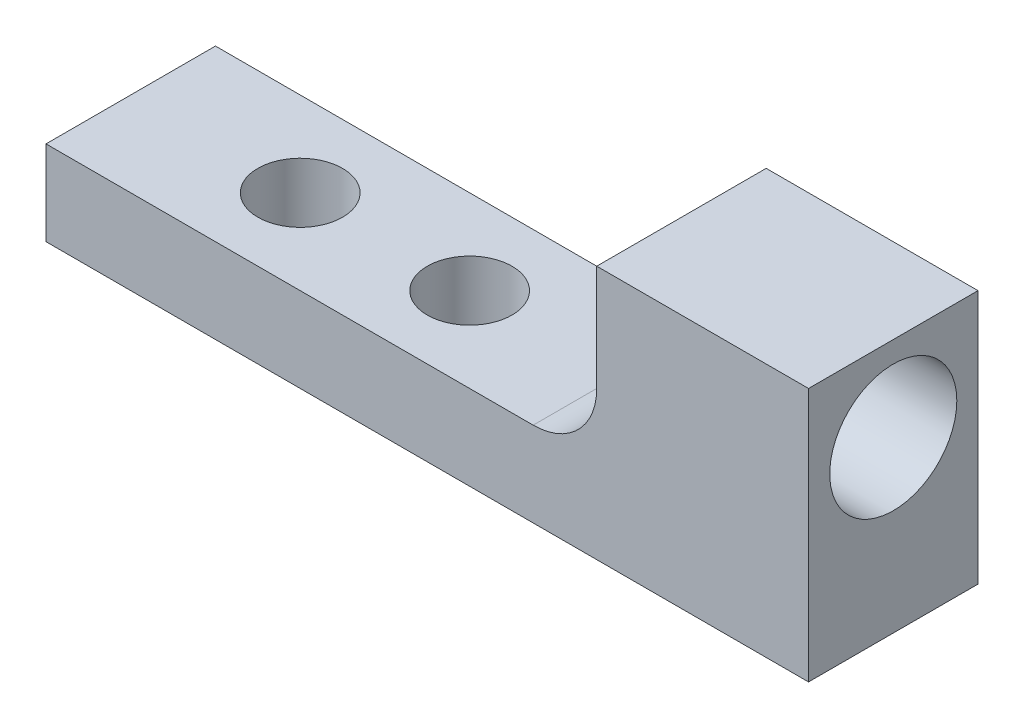
ISO-10303-21;
HEADER;
FILE_DESCRIPTION(('STEP AP214'),'2;1');
FILE_NAME('part.step','',(''),(''),'','','');
FILE_SCHEMA(('AUTOMOTIVE_DESIGN { 1 0 10303 214 1 1 1 1 }'));
ENDSEC;
DATA;
#1=APPLICATION_CONTEXT('core data for automotive mechanical design processes');
#2=APPLICATION_PROTOCOL_DEFINITION('international standard','automotive_design',2000,#1);
#3=PRODUCT_CONTEXT('',#1,'mechanical');
#4=PRODUCT('Part','Part','',(#3));
#5=PRODUCT_RELATED_PRODUCT_CATEGORY('part','',(#4));
#6=PRODUCT_DEFINITION_FORMATION('','',#4);
#7=PRODUCT_DEFINITION_CONTEXT('part definition',#1,'design');
#8=PRODUCT_DEFINITION('design','',#6,#7);
#9=PRODUCT_DEFINITION_SHAPE('','',#8);
#10=(LENGTH_UNIT() NAMED_UNIT(*) SI_UNIT(.MILLI.,.METRE.));
#11=(NAMED_UNIT(*) PLANE_ANGLE_UNIT() SI_UNIT($,.RADIAN.));
#12=(NAMED_UNIT(*) SI_UNIT($,.STERADIAN.) SOLID_ANGLE_UNIT());
#13=UNCERTAINTY_MEASURE_WITH_UNIT(LENGTH_MEASURE(1.E-05),#10,'distance_accuracy_value','');
#14=(GEOMETRIC_REPRESENTATION_CONTEXT(3) GLOBAL_UNCERTAINTY_ASSIGNED_CONTEXT((#13)) GLOBAL_UNIT_ASSIGNED_CONTEXT((#10,
#11,#12)) REPRESENTATION_CONTEXT('',''));
#15=CARTESIAN_POINT('',(0.,0.,0.));
#16=DIRECTION('',(0.,0.,1.));
#17=DIRECTION('',(1.,0.,0.));
#18=AXIS2_PLACEMENT_3D('',#15,#16,#17);
#19=CARTESIAN_POINT('',(0.,3.175,-3.175));
#20=DIRECTION('',(0.,0.,-1.));
#21=DIRECTION('',(-1.,0.,0.));
#22=AXIS2_PLACEMENT_3D('',#19,#20,#21);
#23=PLANE('',#22);
#24=DIRECTION('',(1.,0.,0.));
#25=VECTOR('',#24,1.);
#26=CARTESIAN_POINT('',(0.,0.,-3.175));
#27=LINE('',#26,#25);
#28=CARTESIAN_POINT('',(-14.2875,0.,-3.175));
#29=VERTEX_POINT('',#28);
#30=CARTESIAN_POINT('',(14.2875,0.,-3.175));
#31=VERTEX_POINT('',#30);
#32=EDGE_CURVE('E163',#29,#31,#27,.T.);
#33=ORIENTED_EDGE('',*,*,#32,.F.);
#34=DIRECTION('',(0.,-1.,0.));
#35=VECTOR('',#34,1.);
#36=CARTESIAN_POINT('',(-14.2875,3.175,-3.175));
#37=LINE('',#36,#35);
#38=CARTESIAN_POINT('',(-14.2875,3.175,-3.175));
#39=VERTEX_POINT('',#38);
#40=EDGE_CURVE('E119',#39,#29,#37,.T.);
#41=ORIENTED_EDGE('',*,*,#40,.F.);
#42=DIRECTION('',(1.,0.,0.));
#43=VECTOR('',#42,1.);
#44=CARTESIAN_POINT('',(0.,3.175,-3.175));
#45=LINE('',#44,#43);
#46=CARTESIAN_POINT('',(3.96874999999999,3.175,-3.175));
#47=VERTEX_POINT('',#46);
#48=EDGE_CURVE('E135',#39,#47,#45,.T.);
#49=ORIENTED_EDGE('',*,*,#48,.T.);
#50=CARTESIAN_POINT('',(3.96874999999999,5.55625,-3.175));
#51=DIRECTION('',(0.,0.,-1.));
#52=DIRECTION('',(-1.,0.,0.));
#53=AXIS2_PLACEMENT_3D('',#50,#51,#52);
#54=CIRCLE('',#53,2.38125);
#55=CARTESIAN_POINT('',(6.34999999999999,5.55625,-3.175));
#56=VERTEX_POINT('',#55);
#57=EDGE_CURVE('E49',#47,#56,#54,.F.);
#58=ORIENTED_EDGE('',*,*,#57,.T.);
#59=DIRECTION('',(0.,-1.,0.));
#60=VECTOR('',#59,1.);
#61=CARTESIAN_POINT('',(6.34999999999999,9.525,-3.175));
#62=LINE('',#61,#60);
#63=CARTESIAN_POINT('',(6.34999999999999,9.525,-3.175));
#64=VERTEX_POINT('',#63);
#65=EDGE_CURVE('E132',#64,#56,#62,.T.);
#66=ORIENTED_EDGE('',*,*,#65,.F.);
#67=DIRECTION('',(1.,0.,0.));
#68=VECTOR('',#67,1.);
#69=CARTESIAN_POINT('',(0.,9.525,-3.175));
#70=LINE('',#69,#68);
#71=CARTESIAN_POINT('',(14.2875,9.525,-3.175));
#72=VERTEX_POINT('',#71);
#73=EDGE_CURVE('E183',#64,#72,#70,.T.);
#74=ORIENTED_EDGE('',*,*,#73,.T.);
#75=DIRECTION('',(0.,-1.,0.));
#76=VECTOR('',#75,1.);
#77=CARTESIAN_POINT('',(14.2875,9.525,-3.175));
#78=LINE('',#77,#76);
#79=EDGE_CURVE('E182',#72,#31,#78,.T.);
#80=ORIENTED_EDGE('',*,*,#79,.T.);
#81=EDGE_LOOP('',(#33,#41,#49,#58,#66,#74,#80));
#82=FACE_BOUND('',#81,.T.);
#83=ADVANCED_FACE('F35',(#82),#23,.T.);
#84=CARTESIAN_POINT('',(-14.2875,3.175,0.));
#85=DIRECTION('',(-1.,0.,0.));
#86=DIRECTION('',(0.,0.,1.));
#87=AXIS2_PLACEMENT_3D('',#84,#85,#86);
#88=PLANE('',#87);
#89=DIRECTION('',(0.,0.,-1.));
#90=VECTOR('',#89,1.);
#91=CARTESIAN_POINT('',(-14.2875,0.,0.));
#92=LINE('',#91,#90);
#93=CARTESIAN_POINT('',(-14.2875,0.,3.175));
#94=VERTEX_POINT('',#93);
#95=EDGE_CURVE('E165',#94,#29,#92,.T.);
#96=ORIENTED_EDGE('',*,*,#95,.F.);
#97=DIRECTION('',(0.,-1.,0.));
#98=VECTOR('',#97,1.);
#99=CARTESIAN_POINT('',(-14.2875,3.175,3.175));
#100=LINE('',#99,#98);
#101=CARTESIAN_POINT('',(-14.2875,3.175,3.175));
#102=VERTEX_POINT('',#101);
#103=EDGE_CURVE('E122',#102,#94,#100,.T.);
#104=ORIENTED_EDGE('',*,*,#103,.F.);
#105=DIRECTION('',(0.,0.,-1.));
#106=VECTOR('',#105,1.);
#107=CARTESIAN_POINT('',(-14.2875,3.175,0.));
#108=LINE('',#107,#106);
#109=EDGE_CURVE('E156',#102,#39,#108,.T.);
#110=ORIENTED_EDGE('',*,*,#109,.T.);
#111=ORIENTED_EDGE('',*,*,#40,.T.);
#112=EDGE_LOOP('',(#96,#104,#110,#111));
#113=FACE_BOUND('',#112,.T.);
#114=ADVANCED_FACE('F179',(#113),#88,.T.);
#115=CARTESIAN_POINT('',(-7.9375,3.175,0.));
#116=DIRECTION('',(0.,-1.,0.));
#117=DIRECTION('',(0.,0.,-1.));
#118=AXIS2_PLACEMENT_3D('',#115,#116,#117);
#119=CYLINDRICAL_SURFACE('',#118,1.5875);
#120=CARTESIAN_POINT('',(-7.9375,3.175,0.));
#121=DIRECTION('',(0.,1.,0.));
#122=DIRECTION('',(0.,0.,1.));
#123=AXIS2_PLACEMENT_3D('',#120,#121,#122);
#124=CIRCLE('',#123,1.5875);
#125=CARTESIAN_POINT('',(-7.9375,3.175,1.5875));
#126=VERTEX_POINT('',#125);
#127=EDGE_CURVE('E151',#126,#126,#124,.T.);
#128=ORIENTED_EDGE('',*,*,#127,.T.);
#129=EDGE_LOOP('',(#128));
#130=FACE_BOUND('',#129,.T.);
#131=CARTESIAN_POINT('',(-7.9375,0.,0.));
#132=DIRECTION('',(0.,1.,0.));
#133=DIRECTION('',(0.,0.,1.));
#134=AXIS2_PLACEMENT_3D('',#131,#132,#133);
#135=CIRCLE('',#134,1.5875);
#136=CARTESIAN_POINT('',(-7.9375,0.,1.5875));
#137=VERTEX_POINT('',#136);
#138=EDGE_CURVE('E142',#137,#137,#135,.T.);
#139=ORIENTED_EDGE('',*,*,#138,.F.);
#140=EDGE_LOOP('',(#139));
#141=FACE_BOUND('',#140,.T.);
#142=ADVANCED_FACE('F215',(#130,#141),#119,.F.);
#143=CARTESIAN_POINT('',(-1.5875,3.175,0.));
#144=DIRECTION('',(0.,-1.,0.));
#145=DIRECTION('',(0.,0.,-1.));
#146=AXIS2_PLACEMENT_3D('',#143,#144,#145);
#147=CYLINDRICAL_SURFACE('',#146,1.5875);
#148=CARTESIAN_POINT('',(-1.5875,3.175,0.));
#149=DIRECTION('',(0.,1.,0.));
#150=DIRECTION('',(0.,0.,1.));
#151=AXIS2_PLACEMENT_3D('',#148,#149,#150);
#152=CIRCLE('',#151,1.5875);
#153=CARTESIAN_POINT('',(-1.5875,3.175,1.5875));
#154=VERTEX_POINT('',#153);
#155=EDGE_CURVE('E148',#154,#154,#152,.T.);
#156=ORIENTED_EDGE('',*,*,#155,.T.);
#157=EDGE_LOOP('',(#156));
#158=FACE_BOUND('',#157,.T.);
#159=CARTESIAN_POINT('',(-1.5875,0.,0.));
#160=DIRECTION('',(0.,1.,0.));
#161=DIRECTION('',(0.,0.,1.));
#162=AXIS2_PLACEMENT_3D('',#159,#160,#161);
#163=CIRCLE('',#162,1.5875);
#164=CARTESIAN_POINT('',(-1.5875,0.,1.5875));
#165=VERTEX_POINT('',#164);
#166=EDGE_CURVE('E138',#165,#165,#163,.T.);
#167=ORIENTED_EDGE('',*,*,#166,.F.);
#168=EDGE_LOOP('',(#167));
#169=FACE_BOUND('',#168,.T.);
#170=ADVANCED_FACE('F220',(#158,#169),#147,.F.);
#171=CARTESIAN_POINT('',(0.,3.175,3.175));
#172=DIRECTION('',(0.,0.,-1.));
#173=DIRECTION('',(-1.,0.,0.));
#174=AXIS2_PLACEMENT_3D('',#171,#172,#173);
#175=PLANE('',#174);
#176=DIRECTION('',(1.,0.,0.));
#177=VECTOR('',#176,1.);
#178=CARTESIAN_POINT('',(0.,0.,3.175));
#179=LINE('',#178,#177);
#180=CARTESIAN_POINT('',(14.2875,0.,3.175));
#181=VERTEX_POINT('',#180);
#182=EDGE_CURVE('E152',#94,#181,#179,.T.);
#183=ORIENTED_EDGE('',*,*,#182,.T.);
#184=DIRECTION('',(0.,-1.,0.));
#185=VECTOR('',#184,1.);
#186=CARTESIAN_POINT('',(14.2875,9.525,3.175));
#187=LINE('',#186,#185);
#188=CARTESIAN_POINT('',(14.2875,9.525,3.175));
#189=VERTEX_POINT('',#188);
#190=EDGE_CURVE('E144',#189,#181,#187,.T.);
#191=ORIENTED_EDGE('',*,*,#190,.F.);
#192=DIRECTION('',(1.,0.,0.));
#193=VECTOR('',#192,1.);
#194=CARTESIAN_POINT('',(0.,9.525,3.175));
#195=LINE('',#194,#193);
#196=CARTESIAN_POINT('',(6.34999999999999,9.525,3.175));
#197=VERTEX_POINT('',#196);
#198=EDGE_CURVE('E193',#197,#189,#195,.T.);
#199=ORIENTED_EDGE('',*,*,#198,.F.);
#200=DIRECTION('',(0.,-1.,0.));
#201=VECTOR('',#200,1.);
#202=CARTESIAN_POINT('',(6.34999999999999,9.525,3.175));
#203=LINE('',#202,#201);
#204=CARTESIAN_POINT('',(6.34999999999999,5.55625,3.175));
#205=VERTEX_POINT('',#204);
#206=EDGE_CURVE('E139',#197,#205,#203,.T.);
#207=ORIENTED_EDGE('',*,*,#206,.T.);
#208=CARTESIAN_POINT('',(3.96874999999999,5.55625,3.175));
#209=DIRECTION('',(0.,0.,-1.));
#210=DIRECTION('',(-1.,0.,0.));
#211=AXIS2_PLACEMENT_3D('',#208,#209,#210);
#212=CIRCLE('',#211,2.38125);
#213=CARTESIAN_POINT('',(3.96874999999999,3.175,3.175));
#214=VERTEX_POINT('',#213);
#215=EDGE_CURVE('E62',#205,#214,#212,.T.);
#216=ORIENTED_EDGE('',*,*,#215,.T.);
#217=DIRECTION('',(1.,0.,0.));
#218=VECTOR('',#217,1.);
#219=CARTESIAN_POINT('',(0.,3.175,3.175));
#220=LINE('',#219,#218);
#221=EDGE_CURVE('E159',#102,#214,#220,.T.);
#222=ORIENTED_EDGE('',*,*,#221,.F.);
#223=ORIENTED_EDGE('',*,*,#103,.T.);
#224=EDGE_LOOP('',(#183,#191,#199,#207,#216,#222,#223));
#225=FACE_BOUND('',#224,.T.);
#226=ADVANCED_FACE('F169',(#225),#175,.F.);
#227=CARTESIAN_POINT('',(0.,3.175,0.));
#228=DIRECTION('',(0.,1.,0.));
#229=DIRECTION('',(0.,0.,1.));
#230=AXIS2_PLACEMENT_3D('',#227,#228,#229);
#231=PLANE('',#230);
#232=ORIENTED_EDGE('',*,*,#155,.F.);
#233=EDGE_LOOP('',(#232));
#234=FACE_BOUND('',#233,.T.);
#235=ORIENTED_EDGE('',*,*,#127,.F.);
#236=EDGE_LOOP('',(#235));
#237=FACE_BOUND('',#236,.T.);
#238=ORIENTED_EDGE('',*,*,#221,.T.);
#239=DIRECTION('',(0.,0.,1.));
#240=VECTOR('',#239,1.);
#241=CARTESIAN_POINT('',(3.96874999999999,3.175,0.));
#242=LINE('',#241,#240);
#243=EDGE_CURVE('E121',#214,#47,#242,.F.);
#244=ORIENTED_EDGE('',*,*,#243,.T.);
#245=ORIENTED_EDGE('',*,*,#48,.F.);
#246=ORIENTED_EDGE('',*,*,#109,.F.);
#247=EDGE_LOOP('',(#238,#244,#245,#246));
#248=FACE_BOUND('',#247,.T.);
#249=ADVANCED_FACE('F227',(#234,#237,#248),#231,.T.);
#250=CARTESIAN_POINT('',(0.,0.,0.));
#251=DIRECTION('',(0.,1.,0.));
#252=DIRECTION('',(0.,0.,1.));
#253=AXIS2_PLACEMENT_3D('',#250,#251,#252);
#254=PLANE('',#253);
#255=ORIENTED_EDGE('',*,*,#166,.T.);
#256=EDGE_LOOP('',(#255));
#257=FACE_BOUND('',#256,.T.);
#258=ORIENTED_EDGE('',*,*,#138,.T.);
#259=EDGE_LOOP('',(#258));
#260=FACE_BOUND('',#259,.T.);
#261=ORIENTED_EDGE('',*,*,#32,.T.);
#262=DIRECTION('',(0.,0.,-1.));
#263=VECTOR('',#262,1.);
#264=CARTESIAN_POINT('',(14.2875,0.,0.));
#265=LINE('',#264,#263);
#266=EDGE_CURVE('E115',#181,#31,#265,.T.);
#267=ORIENTED_EDGE('',*,*,#266,.F.);
#268=ORIENTED_EDGE('',*,*,#182,.F.);
#269=ORIENTED_EDGE('',*,*,#95,.T.);
#270=EDGE_LOOP('',(#261,#267,#268,#269));
#271=FACE_BOUND('',#270,.T.);
#272=ADVANCED_FACE('F177',(#257,#260,#271),#254,.F.);
#273=CARTESIAN_POINT('',(6.34999999999999,9.525,0.));
#274=DIRECTION('',(1.,0.,0.));
#275=DIRECTION('',(0.,0.,-1.));
#276=AXIS2_PLACEMENT_3D('',#273,#274,#275);
#277=PLANE('',#276);
#278=DIRECTION('',(0.,0.,1.));
#279=VECTOR('',#278,1.);
#280=CARTESIAN_POINT('',(6.34999999999999,5.55625,0.));
#281=LINE('',#280,#279);
#282=CARTESIAN_POINT('',(6.34999999999999,5.55625,-2.24506403026729));
#283=VERTEX_POINT('',#282);
#284=EDGE_CURVE('E114',#56,#283,#281,.T.);
#285=ORIENTED_EDGE('',*,*,#284,.T.);
#286=CARTESIAN_POINT('',(6.34999999999999,6.35,0.));
#287=DIRECTION('',(1.,0.,0.));
#288=DIRECTION('',(0.,0.,-1.));
#289=AXIS2_PLACEMENT_3D('',#286,#287,#288);
#290=CIRCLE('',#289,2.38125);
#291=CARTESIAN_POINT('',(6.34999999999999,5.55625,2.24506403026729));
#292=VERTEX_POINT('',#291);
#293=EDGE_CURVE('E55',#283,#292,#290,.T.);
#294=ORIENTED_EDGE('',*,*,#293,.T.);
#295=EDGE_CURVE('E112',#292,#205,#281,.T.);
#296=ORIENTED_EDGE('',*,*,#295,.T.);
#297=ORIENTED_EDGE('',*,*,#206,.F.);
#298=DIRECTION('',(0.,0.,1.));
#299=VECTOR('',#298,1.);
#300=CARTESIAN_POINT('',(6.34999999999999,9.525,0.));
#301=LINE('',#300,#299);
#302=EDGE_CURVE('E136',#64,#197,#301,.T.);
#303=ORIENTED_EDGE('',*,*,#302,.F.);
#304=ORIENTED_EDGE('',*,*,#65,.T.);
#305=EDGE_LOOP('',(#285,#294,#296,#297,#303,#304));
#306=FACE_BOUND('',#305,.T.);
#307=ADVANCED_FACE('F110',(#306),#277,.F.);
#308=CARTESIAN_POINT('',(14.2875,9.525,0.));
#309=DIRECTION('',(-1.,0.,0.));
#310=DIRECTION('',(0.,0.,1.));
#311=AXIS2_PLACEMENT_3D('',#308,#309,#310);
#312=PLANE('',#311);
#313=CARTESIAN_POINT('',(14.2875,6.35,0.));
#314=DIRECTION('',(1.,0.,0.));
#315=DIRECTION('',(0.,0.,-1.));
#316=AXIS2_PLACEMENT_3D('',#313,#314,#315);
#317=CIRCLE('',#316,2.38125);
#318=CARTESIAN_POINT('',(14.2875,6.35,-2.38125));
#319=VERTEX_POINT('',#318);
#320=EDGE_CURVE('E116',#319,#319,#317,.T.);
#321=ORIENTED_EDGE('',*,*,#320,.F.);
#322=EDGE_LOOP('',(#321));
#323=FACE_BOUND('',#322,.T.);
#324=ORIENTED_EDGE('',*,*,#266,.T.);
#325=ORIENTED_EDGE('',*,*,#79,.F.);
#326=DIRECTION('',(0.,0.,-1.));
#327=VECTOR('',#326,1.);
#328=CARTESIAN_POINT('',(14.2875,9.525,0.));
#329=LINE('',#328,#327);
#330=EDGE_CURVE('E186',#189,#72,#329,.T.);
#331=ORIENTED_EDGE('',*,*,#330,.F.);
#332=ORIENTED_EDGE('',*,*,#190,.T.);
#333=EDGE_LOOP('',(#324,#325,#331,#332));
#334=FACE_BOUND('',#333,.T.);
#335=ADVANCED_FACE('F188',(#323,#334),#312,.F.);
#336=CARTESIAN_POINT('',(0.,9.525,0.));
#337=DIRECTION('',(0.,1.,0.));
#338=DIRECTION('',(0.,0.,1.));
#339=AXIS2_PLACEMENT_3D('',#336,#337,#338);
#340=PLANE('',#339);
#341=ORIENTED_EDGE('',*,*,#73,.F.);
#342=ORIENTED_EDGE('',*,*,#302,.T.);
#343=ORIENTED_EDGE('',*,*,#198,.T.);
#344=ORIENTED_EDGE('',*,*,#330,.T.);
#345=EDGE_LOOP('',(#341,#342,#343,#344));
#346=FACE_BOUND('',#345,.T.);
#347=ADVANCED_FACE('F201',(#346),#340,.T.);
#348=CARTESIAN_POINT('',(3.96874999999999,5.55625,0.));
#349=DIRECTION('',(0.,0.,1.));
#350=DIRECTION('',(1.,0.,0.));
#351=AXIS2_PLACEMENT_3D('',#348,#349,#350);
#352=CYLINDRICAL_SURFACE('',#351,2.38125);
#353=ORIENTED_EDGE('',*,*,#295,.F.);
#354=CARTESIAN_POINT('',(6.34999999999999,5.55625,2.24506403026729));
#355=CARTESIAN_POINT('',(6.35001151659019,5.49949615317054,2.22501351187942));
#356=CARTESIAN_POINT('',(6.34797180694622,5.44354355663119,2.20279633750289));
#357=CARTESIAN_POINT('',(6.34021749486613,5.33375880328683,2.15434034755838));
#358=CARTESIAN_POINT('',(6.33450797951025,5.27992382050516,2.12810713730465));
#359=CARTESIAN_POINT('',(6.31990653271091,5.17521487386776,2.07213144750013));
#360=CARTESIAN_POINT('',(6.31104425062348,5.12431829250354,2.04242333747497));
#361=CARTESIAN_POINT('',(6.29059157956659,5.02524702140347,1.97960216763515));
#362=CARTESIAN_POINT('',(6.27900030465424,4.97707322190552,1.94648800404598));
#363=CARTESIAN_POINT('',(6.24097456359637,4.83750357361057,1.84284304684318));
#364=CARTESIAN_POINT('',(6.21118705246757,4.75041133141559,1.76765934143737));
#365=CARTESIAN_POINT('',(6.14631228172948,4.5886704008771,1.60660131569503));
#366=CARTESIAN_POINT('',(6.11120840068718,4.51406234043007,1.52069362069229));
#367=CARTESIAN_POINT('',(6.03422323662872,4.36800269164576,1.32624470486985));
#368=CARTESIAN_POINT('',(5.99210419523681,4.29862702663742,1.21623270549029));
#369=CARTESIAN_POINT('',(5.91209845177655,4.17821814831929,0.985214461627834));
#370=CARTESIAN_POINT('',(5.87420709609457,4.12716462691457,0.864220576972561));
#371=CARTESIAN_POINT('',(5.81659013607969,4.05373543621167,0.639083284633319));
#372=CARTESIAN_POINT('',(5.79472081497641,4.02758914242878,0.536735867444488));
#373=CARTESIAN_POINT('',(5.76176780044549,3.98905434272523,0.327890160692679));
#374=CARTESIAN_POINT('',(5.75066141289114,3.97663688111925,0.221401099625083));
#375=CARTESIAN_POINT('',(5.74147506536479,3.9663259484391,0.00664213190944351));
#376=CARTESIAN_POINT('',(5.74345303680184,3.96849706944034,-0.101633574453921));
#377=CARTESIAN_POINT('',(5.76012881513658,3.98734862353301,-0.315986180503541));
#378=CARTESIAN_POINT('',(5.77484567318751,4.00405078816007,-0.422059543152588));
#379=CARTESIAN_POINT('',(5.81785053254804,4.05542212779636,-0.649078177800143));
#380=CARTESIAN_POINT('',(5.84820015759895,4.09292305249315,-0.768973504296376));
#381=CARTESIAN_POINT('',(5.91650171194143,4.18515777606634,-0.999652310794705));
#382=CARTESIAN_POINT('',(5.95446709391939,4.23992216884656,-1.11041917052041));
#383=CARTESIAN_POINT('',(6.03300705792839,4.3667609162049,-1.32395330020239));
#384=CARTESIAN_POINT('',(6.07361950489614,4.43917190102847,-1.42650602471923));
#385=CARTESIAN_POINT('',(6.15136959089091,4.59996283492208,-1.619716523452));
#386=CARTESIAN_POINT('',(6.18850978184657,4.68833091407619,-1.71038305343742));
#387=CARTESIAN_POINT('',(6.24979377314395,4.8671337011601,-1.86643135692159));
#388=CARTESIAN_POINT('',(6.27501785538481,4.95565543314712,-1.9335748275789));
#389=CARTESIAN_POINT('',(6.31575577870119,5.14271880010727,-2.05552908706615));
#390=CARTESIAN_POINT('',(6.33129778803945,5.24123038976451,-2.11037535158073));
#391=CARTESIAN_POINT('',(6.34358859502703,5.37816752603109,-2.1742510102218));
#392=CARTESIAN_POINT('',(6.34596891611014,5.41326179871181,-2.18959944855538));
#393=CARTESIAN_POINT('',(6.34917438671102,5.48421156101243,-2.2186092534889));
#394=CARTESIAN_POINT('',(6.34999946733791,5.52006708428152,-2.23227054533));
#395=CARTESIAN_POINT('',(6.35,5.55625,-2.24506403026729));
#396=B_SPLINE_CURVE_WITH_KNOTS('',3,(#354,#355,#356,#357,#358,#359,#360,#361,#362,#363,#364,
#365,#366,#367,#368,#369,#370,#371,#372,#373,#374,#375,#376,#377,#378,#379,#380,#381,#382,#383,
#384,#385,#386,#387,#388,#389,#390,#391,#392,#393,#394,#395),.UNSPECIFIED.,.F.,.F.,(4,2,2,2,2,2,
2,2,2,2,2,2,2,2,2,2,2,2,2,2,4),(0.,0.180446423612096,0.360643250491278,0.539188412877404,
0.717791618459554,1.07279437553769,1.42893086674645,1.83741539600534,2.24544575616664,
2.56780463406098,2.8894823152857,3.21258518483713,3.53617209497259,3.92182587543782,
4.30816698131569,4.70255108421589,5.0966430183158,5.43717683383555,5.77671524263976,
5.89178795237575,6.00686575924904),.UNSPECIFIED.);
#397=EDGE_CURVE('E11',#292,#283,#396,.T.);
#398=ORIENTED_EDGE('',*,*,#397,.T.);
#399=ORIENTED_EDGE('',*,*,#284,.F.);
#400=ORIENTED_EDGE('',*,*,#57,.F.);
#401=ORIENTED_EDGE('',*,*,#243,.F.);
#402=ORIENTED_EDGE('',*,*,#215,.F.);
#403=EDGE_LOOP('',(#353,#398,#399,#400,#401,#402));
#404=FACE_BOUND('',#403,.T.);
#405=ADVANCED_FACE('F37',(#404),#352,.F.);
#406=CARTESIAN_POINT('',(-14.2875,6.35,0.));
#407=DIRECTION('',(1.,0.,0.));
#408=DIRECTION('',(0.,0.,-1.));
#409=AXIS2_PLACEMENT_3D('',#406,#407,#408);
#410=CYLINDRICAL_SURFACE('',#409,2.38125);
#411=ORIENTED_EDGE('',*,*,#320,.T.);
#412=EDGE_LOOP('',(#411));
#413=FACE_BOUND('',#412,.T.);
#414=ORIENTED_EDGE('',*,*,#397,.F.);
#415=ORIENTED_EDGE('',*,*,#293,.F.);
#416=EDGE_LOOP('',(#414,#415));
#417=FACE_BOUND('',#416,.T.);
#418=ADVANCED_FACE('F104',(#413,#417),#410,.F.);
#419=CLOSED_SHELL('',(#83,#114,#142,#170,#226,#249,#272,#307,#335,#347,#405,#418));
#420=MANIFOLD_SOLID_BREP('B2',#419);
#421=ADVANCED_BREP_SHAPE_REPRESENTATION('',(#18,#420),#14);
#422=SHAPE_DEFINITION_REPRESENTATION(#9,#421);
ENDSEC;
END-ISO-10303-21;
